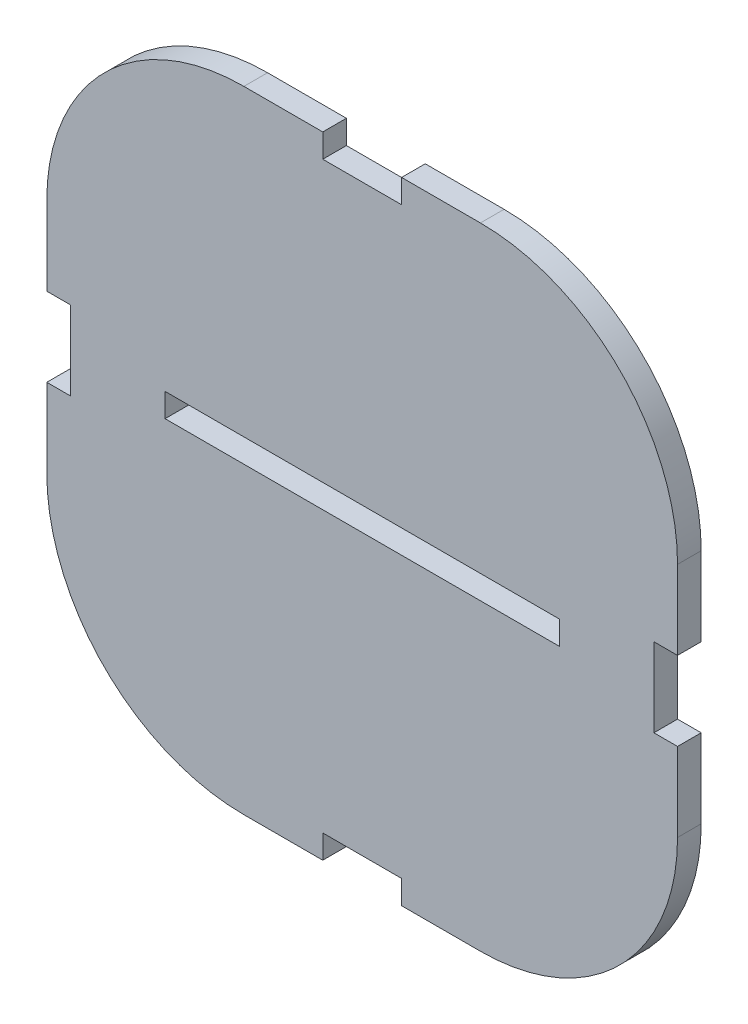
ISO-10303-21;
HEADER;
FILE_DESCRIPTION(('STEP AP214'),'2;1');
FILE_NAME('part.step','',(''),(''),'','','');
FILE_SCHEMA(('AUTOMOTIVE_DESIGN { 1 0 10303 214 1 1 1 1 }'));
ENDSEC;
DATA;
#1=APPLICATION_CONTEXT('core data for automotive mechanical design processes');
#2=APPLICATION_PROTOCOL_DEFINITION('international standard','automotive_design',2000,#1);
#3=PRODUCT_CONTEXT('',#1,'mechanical');
#4=PRODUCT('Part','Part','',(#3));
#5=PRODUCT_RELATED_PRODUCT_CATEGORY('part','',(#4));
#6=PRODUCT_DEFINITION_FORMATION('','',#4);
#7=PRODUCT_DEFINITION_CONTEXT('part definition',#1,'design');
#8=PRODUCT_DEFINITION('design','',#6,#7);
#9=PRODUCT_DEFINITION_SHAPE('','',#8);
#10=(LENGTH_UNIT() NAMED_UNIT(*) SI_UNIT(.MILLI.,.METRE.));
#11=(NAMED_UNIT(*) PLANE_ANGLE_UNIT() SI_UNIT($,.RADIAN.));
#12=(NAMED_UNIT(*) SI_UNIT($,.STERADIAN.) SOLID_ANGLE_UNIT());
#13=UNCERTAINTY_MEASURE_WITH_UNIT(LENGTH_MEASURE(1.E-05),#10,'distance_accuracy_value','');
#14=(GEOMETRIC_REPRESENTATION_CONTEXT(3) GLOBAL_UNCERTAINTY_ASSIGNED_CONTEXT((#13)) GLOBAL_UNIT_ASSIGNED_CONTEXT((#10,
#11,#12)) REPRESENTATION_CONTEXT('',''));
#15=CARTESIAN_POINT('',(0.,0.,0.));
#16=DIRECTION('',(0.,0.,1.));
#17=DIRECTION('',(1.,0.,0.));
#18=AXIS2_PLACEMENT_3D('',#15,#16,#17);
#19=CARTESIAN_POINT('',(0.,40.,3.));
#20=DIRECTION('',(0.,1.,0.));
#21=DIRECTION('',(-1.,0.,0.));
#22=AXIS2_PLACEMENT_3D('',#19,#20,#21);
#23=PLANE('',#22);
#24=DIRECTION('',(1.,0.,0.));
#25=VECTOR('',#24,1.);
#26=CARTESIAN_POINT('',(0.,40.,0.));
#27=LINE('',#26,#25);
#28=CARTESIAN_POINT('',(-15.,40.,0.));
#29=VERTEX_POINT('',#28);
#30=CARTESIAN_POINT('',(-5.,40.,0.));
#31=VERTEX_POINT('',#30);
#32=EDGE_CURVE('E268',#29,#31,#27,.T.);
#33=ORIENTED_EDGE('',*,*,#32,.F.);
#34=DIRECTION('',(0.,0.,-1.));
#35=VECTOR('',#34,1.);
#36=CARTESIAN_POINT('',(-15.,40.,3.));
#37=LINE('',#36,#35);
#38=CARTESIAN_POINT('',(-15.,40.,3.));
#39=VERTEX_POINT('',#38);
#40=EDGE_CURVE('E11',#39,#29,#37,.T.);
#41=ORIENTED_EDGE('',*,*,#40,.F.);
#42=DIRECTION('',(1.,0.,0.));
#43=VECTOR('',#42,1.);
#44=CARTESIAN_POINT('',(0.,40.,3.));
#45=LINE('',#44,#43);
#46=CARTESIAN_POINT('',(-5.,40.,3.));
#47=VERTEX_POINT('',#46);
#48=EDGE_CURVE('E695',#39,#47,#45,.T.);
#49=ORIENTED_EDGE('',*,*,#48,.T.);
#50=DIRECTION('',(0.,0.,-1.));
#51=VECTOR('',#50,1.);
#52=CARTESIAN_POINT('',(-5.,40.,3.));
#53=LINE('',#52,#51);
#54=EDGE_CURVE('E53',#47,#31,#53,.T.);
#55=ORIENTED_EDGE('',*,*,#54,.T.);
#56=EDGE_LOOP('',(#33,#41,#49,#55));
#57=FACE_BOUND('',#56,.T.);
#58=ADVANCED_FACE('F34',(#57),#23,.T.);
#59=CARTESIAN_POINT('',(-15.,15.,3.));
#60=DIRECTION('',(0.,0.,-1.));
#61=DIRECTION('',(-1.,0.,0.));
#62=AXIS2_PLACEMENT_3D('',#59,#60,#61);
#63=CYLINDRICAL_SURFACE('',#62,25.);
#64=CARTESIAN_POINT('',(-15.,15.,0.));
#65=DIRECTION('',(0.,0.,1.));
#66=DIRECTION('',(1.,0.,0.));
#67=AXIS2_PLACEMENT_3D('',#64,#65,#66);
#68=CIRCLE('',#67,25.);
#69=CARTESIAN_POINT('',(-40.,15.,0.));
#70=VERTEX_POINT('',#69);
#71=EDGE_CURVE('E270',#29,#70,#68,.T.);
#72=ORIENTED_EDGE('',*,*,#71,.T.);
#73=DIRECTION('',(0.,0.,-1.));
#74=VECTOR('',#73,1.);
#75=CARTESIAN_POINT('',(-40.,15.,3.));
#76=LINE('',#75,#74);
#77=CARTESIAN_POINT('',(-40.,15.,3.));
#78=VERTEX_POINT('',#77);
#79=EDGE_CURVE('E44',#78,#70,#76,.T.);
#80=ORIENTED_EDGE('',*,*,#79,.F.);
#81=CARTESIAN_POINT('',(-15.,15.,3.));
#82=DIRECTION('',(0.,0.,1.));
#83=DIRECTION('',(1.,0.,0.));
#84=AXIS2_PLACEMENT_3D('',#81,#82,#83);
#85=CIRCLE('',#84,25.);
#86=EDGE_CURVE('E692',#39,#78,#85,.T.);
#87=ORIENTED_EDGE('',*,*,#86,.F.);
#88=ORIENTED_EDGE('',*,*,#40,.T.);
#89=EDGE_LOOP('',(#72,#80,#87,#88));
#90=FACE_BOUND('',#89,.T.);
#91=ADVANCED_FACE('F408',(#90),#63,.T.);
#92=CARTESIAN_POINT('',(-40.,0.,3.));
#93=DIRECTION('',(1.,0.,0.));
#94=DIRECTION('',(0.,1.,0.));
#95=AXIS2_PLACEMENT_3D('',#92,#93,#94);
#96=PLANE('',#95);
#97=DIRECTION('',(0.,-1.,0.));
#98=VECTOR('',#97,1.);
#99=CARTESIAN_POINT('',(-40.,0.,0.));
#100=LINE('',#99,#98);
#101=CARTESIAN_POINT('',(-40.,4.99999999999999,0.));
#102=VERTEX_POINT('',#101);
#103=EDGE_CURVE('E274',#70,#102,#100,.T.);
#104=ORIENTED_EDGE('',*,*,#103,.T.);
#105=DIRECTION('',(0.,0.,-1.));
#106=VECTOR('',#105,1.);
#107=CARTESIAN_POINT('',(-40.,4.99999999999999,3.));
#108=LINE('',#107,#106);
#109=CARTESIAN_POINT('',(-40.,4.99999999999999,3.));
#110=VERTEX_POINT('',#109);
#111=EDGE_CURVE('E372',#110,#102,#108,.T.);
#112=ORIENTED_EDGE('',*,*,#111,.F.);
#113=DIRECTION('',(0.,-1.,0.));
#114=VECTOR('',#113,1.);
#115=CARTESIAN_POINT('',(-40.,0.,3.));
#116=LINE('',#115,#114);
#117=EDGE_CURVE('E688',#78,#110,#116,.T.);
#118=ORIENTED_EDGE('',*,*,#117,.F.);
#119=ORIENTED_EDGE('',*,*,#79,.T.);
#120=EDGE_LOOP('',(#104,#112,#118,#119));
#121=FACE_BOUND('',#120,.T.);
#122=ADVANCED_FACE('F414',(#121),#96,.F.);
#123=CARTESIAN_POINT('',(0.,4.99999999999999,3.));
#124=DIRECTION('',(0.,1.,0.));
#125=DIRECTION('',(0.,0.,1.));
#126=AXIS2_PLACEMENT_3D('',#123,#124,#125);
#127=PLANE('',#126);
#128=DIRECTION('',(1.,0.,0.));
#129=VECTOR('',#128,1.);
#130=CARTESIAN_POINT('',(0.,4.99999999999999,0.));
#131=LINE('',#130,#129);
#132=CARTESIAN_POINT('',(-37.,4.99999999999999,0.));
#133=VERTEX_POINT('',#132);
#134=EDGE_CURVE('E277',#102,#133,#131,.T.);
#135=ORIENTED_EDGE('',*,*,#134,.T.);
#136=DIRECTION('',(0.,0.,-1.));
#137=VECTOR('',#136,1.);
#138=CARTESIAN_POINT('',(-37.,4.99999999999999,3.));
#139=LINE('',#138,#137);
#140=CARTESIAN_POINT('',(-37.,4.99999999999999,3.));
#141=VERTEX_POINT('',#140);
#142=EDGE_CURVE('E370',#141,#133,#139,.T.);
#143=ORIENTED_EDGE('',*,*,#142,.F.);
#144=DIRECTION('',(1.,0.,0.));
#145=VECTOR('',#144,1.);
#146=CARTESIAN_POINT('',(0.,4.99999999999999,3.));
#147=LINE('',#146,#145);
#148=EDGE_CURVE('E683',#110,#141,#147,.T.);
#149=ORIENTED_EDGE('',*,*,#148,.F.);
#150=ORIENTED_EDGE('',*,*,#111,.T.);
#151=EDGE_LOOP('',(#135,#143,#149,#150));
#152=FACE_BOUND('',#151,.T.);
#153=ADVANCED_FACE('F633',(#152),#127,.F.);
#154=CARTESIAN_POINT('',(-37.,0.,3.));
#155=DIRECTION('',(-1.,0.,0.));
#156=DIRECTION('',(0.,0.,1.));
#157=AXIS2_PLACEMENT_3D('',#154,#155,#156);
#158=PLANE('',#157);
#159=DIRECTION('',(0.,1.,0.));
#160=VECTOR('',#159,1.);
#161=CARTESIAN_POINT('',(-37.,0.,0.));
#162=LINE('',#161,#160);
#163=CARTESIAN_POINT('',(-37.,-5.00000000000001,0.));
#164=VERTEX_POINT('',#163);
#165=EDGE_CURVE('E281',#164,#133,#162,.T.);
#166=ORIENTED_EDGE('',*,*,#165,.F.);
#167=DIRECTION('',(0.,0.,-1.));
#168=VECTOR('',#167,1.);
#169=CARTESIAN_POINT('',(-37.,-5.00000000000001,3.));
#170=LINE('',#169,#168);
#171=CARTESIAN_POINT('',(-37.,-5.00000000000001,3.));
#172=VERTEX_POINT('',#171);
#173=EDGE_CURVE('E368',#172,#164,#170,.T.);
#174=ORIENTED_EDGE('',*,*,#173,.F.);
#175=DIRECTION('',(0.,1.,0.));
#176=VECTOR('',#175,1.);
#177=CARTESIAN_POINT('',(-37.,0.,3.));
#178=LINE('',#177,#176);
#179=EDGE_CURVE('E687',#172,#141,#178,.T.);
#180=ORIENTED_EDGE('',*,*,#179,.T.);
#181=ORIENTED_EDGE('',*,*,#142,.T.);
#182=EDGE_LOOP('',(#166,#174,#180,#181));
#183=FACE_BOUND('',#182,.T.);
#184=ADVANCED_FACE('F624',(#183),#158,.T.);
#185=CARTESIAN_POINT('',(0.,-4.99999999999999,3.));
#186=DIRECTION('',(0.,1.,0.));
#187=DIRECTION('',(-1.,0.,0.));
#188=AXIS2_PLACEMENT_3D('',#185,#186,#187);
#189=PLANE('',#188);
#190=DIRECTION('',(1.,0.,0.));
#191=VECTOR('',#190,1.);
#192=CARTESIAN_POINT('',(0.,-4.99999999999999,0.));
#193=LINE('',#192,#191);
#194=CARTESIAN_POINT('',(-40.,-5.00000000000001,0.));
#195=VERTEX_POINT('',#194);
#196=EDGE_CURVE('E284',#195,#164,#193,.T.);
#197=ORIENTED_EDGE('',*,*,#196,.F.);
#198=DIRECTION('',(0.,0.,-1.));
#199=VECTOR('',#198,1.);
#200=CARTESIAN_POINT('',(-40.,-5.00000000000001,3.));
#201=LINE('',#200,#199);
#202=CARTESIAN_POINT('',(-40.,-5.00000000000001,3.));
#203=VERTEX_POINT('',#202);
#204=EDGE_CURVE('E366',#203,#195,#201,.T.);
#205=ORIENTED_EDGE('',*,*,#204,.F.);
#206=DIRECTION('',(1.,0.,0.));
#207=VECTOR('',#206,1.);
#208=CARTESIAN_POINT('',(0.,-4.99999999999999,3.));
#209=LINE('',#208,#207);
#210=EDGE_CURVE('E699',#203,#172,#209,.T.);
#211=ORIENTED_EDGE('',*,*,#210,.T.);
#212=ORIENTED_EDGE('',*,*,#173,.T.);
#213=EDGE_LOOP('',(#197,#205,#211,#212));
#214=FACE_BOUND('',#213,.T.);
#215=ADVANCED_FACE('F615',(#214),#189,.T.);
#216=CARTESIAN_POINT('',(-40.,-15.,0.));
#217=VERTEX_POINT('',#216);
#218=EDGE_CURVE('E278',#195,#217,#100,.T.);
#219=ORIENTED_EDGE('',*,*,#218,.T.);
#220=DIRECTION('',(0.,0.,-1.));
#221=VECTOR('',#220,1.);
#222=CARTESIAN_POINT('',(-40.,-15.,3.));
#223=LINE('',#222,#221);
#224=CARTESIAN_POINT('',(-40.,-15.,3.));
#225=VERTEX_POINT('',#224);
#226=EDGE_CURVE('E363',#225,#217,#223,.T.);
#227=ORIENTED_EDGE('',*,*,#226,.F.);
#228=EDGE_CURVE('E694',#203,#225,#116,.T.);
#229=ORIENTED_EDGE('',*,*,#228,.F.);
#230=ORIENTED_EDGE('',*,*,#204,.T.);
#231=EDGE_LOOP('',(#219,#227,#229,#230));
#232=FACE_BOUND('',#231,.T.);
#233=ADVANCED_FACE('F606',(#232),#96,.F.);
#234=CARTESIAN_POINT('',(-15.,-15.,3.));
#235=DIRECTION('',(0.,0.,-1.));
#236=DIRECTION('',(-1.,0.,0.));
#237=AXIS2_PLACEMENT_3D('',#234,#235,#236);
#238=CYLINDRICAL_SURFACE('',#237,25.);
#239=CARTESIAN_POINT('',(-15.,-15.,0.));
#240=DIRECTION('',(0.,0.,1.));
#241=DIRECTION('',(1.,0.,0.));
#242=AXIS2_PLACEMENT_3D('',#239,#240,#241);
#243=CIRCLE('',#242,25.);
#244=CARTESIAN_POINT('',(-15.,-40.,0.));
#245=VERTEX_POINT('',#244);
#246=EDGE_CURVE('E287',#217,#245,#243,.T.);
#247=ORIENTED_EDGE('',*,*,#246,.T.);
#248=DIRECTION('',(0.,0.,-1.));
#249=VECTOR('',#248,1.);
#250=CARTESIAN_POINT('',(-15.,-40.,3.));
#251=LINE('',#250,#249);
#252=CARTESIAN_POINT('',(-15.,-40.,3.));
#253=VERTEX_POINT('',#252);
#254=EDGE_CURVE('E360',#253,#245,#251,.T.);
#255=ORIENTED_EDGE('',*,*,#254,.F.);
#256=CARTESIAN_POINT('',(-15.,-15.,3.));
#257=DIRECTION('',(0.,0.,1.));
#258=DIRECTION('',(1.,0.,0.));
#259=AXIS2_PLACEMENT_3D('',#256,#257,#258);
#260=CIRCLE('',#259,25.);
#261=EDGE_CURVE('E698',#225,#253,#260,.T.);
#262=ORIENTED_EDGE('',*,*,#261,.F.);
#263=ORIENTED_EDGE('',*,*,#226,.T.);
#264=EDGE_LOOP('',(#247,#255,#262,#263));
#265=FACE_BOUND('',#264,.T.);
#266=ADVANCED_FACE('F598',(#265),#238,.T.);
#267=CARTESIAN_POINT('',(0.,-40.,3.));
#268=DIRECTION('',(0.,1.,0.));
#269=DIRECTION('',(-1.,0.,0.));
#270=AXIS2_PLACEMENT_3D('',#267,#268,#269);
#271=PLANE('',#270);
#272=DIRECTION('',(1.,0.,0.));
#273=VECTOR('',#272,1.);
#274=CARTESIAN_POINT('',(0.,-40.,0.));
#275=LINE('',#274,#273);
#276=CARTESIAN_POINT('',(-4.99999999999998,-40.,0.));
#277=VERTEX_POINT('',#276);
#278=EDGE_CURVE('E290',#245,#277,#275,.T.);
#279=ORIENTED_EDGE('',*,*,#278,.T.);
#280=DIRECTION('',(0.,0.,-1.));
#281=VECTOR('',#280,1.);
#282=CARTESIAN_POINT('',(-4.99999999999998,-40.,3.));
#283=LINE('',#282,#281);
#284=CARTESIAN_POINT('',(-4.99999999999998,-40.,3.));
#285=VERTEX_POINT('',#284);
#286=EDGE_CURVE('E357',#285,#277,#283,.T.);
#287=ORIENTED_EDGE('',*,*,#286,.F.);
#288=DIRECTION('',(1.,0.,0.));
#289=VECTOR('',#288,1.);
#290=CARTESIAN_POINT('',(0.,-40.,3.));
#291=LINE('',#290,#289);
#292=EDGE_CURVE('E704',#253,#285,#291,.T.);
#293=ORIENTED_EDGE('',*,*,#292,.F.);
#294=ORIENTED_EDGE('',*,*,#254,.T.);
#295=EDGE_LOOP('',(#279,#287,#293,#294));
#296=FACE_BOUND('',#295,.T.);
#297=ADVANCED_FACE('F565',(#296),#271,.F.);
#298=CARTESIAN_POINT('',(-5.00000000000016,0.,3.));
#299=DIRECTION('',(-1.,0.,0.));
#300=DIRECTION('',(0.,-1.,0.));
#301=AXIS2_PLACEMENT_3D('',#298,#299,#300);
#302=PLANE('',#301);
#303=DIRECTION('',(0.,1.,0.));
#304=VECTOR('',#303,1.);
#305=CARTESIAN_POINT('',(-5.00000000000016,0.,0.));
#306=LINE('',#305,#304);
#307=CARTESIAN_POINT('',(-4.99999999999999,-37.,0.));
#308=VERTEX_POINT('',#307);
#309=EDGE_CURVE('E293',#277,#308,#306,.T.);
#310=ORIENTED_EDGE('',*,*,#309,.T.);
#311=DIRECTION('',(0.,0.,-1.));
#312=VECTOR('',#311,1.);
#313=CARTESIAN_POINT('',(-4.99999999999999,-37.,3.));
#314=LINE('',#313,#312);
#315=CARTESIAN_POINT('',(-4.99999999999999,-37.,3.));
#316=VERTEX_POINT('',#315);
#317=EDGE_CURVE('E354',#316,#308,#314,.T.);
#318=ORIENTED_EDGE('',*,*,#317,.F.);
#319=DIRECTION('',(0.,1.,0.));
#320=VECTOR('',#319,1.);
#321=CARTESIAN_POINT('',(-5.00000000000016,0.,3.));
#322=LINE('',#321,#320);
#323=EDGE_CURVE('E712',#285,#316,#322,.T.);
#324=ORIENTED_EDGE('',*,*,#323,.F.);
#325=ORIENTED_EDGE('',*,*,#286,.T.);
#326=EDGE_LOOP('',(#310,#318,#324,#325));
#327=FACE_BOUND('',#326,.T.);
#328=ADVANCED_FACE('F581',(#327),#302,.F.);
#329=CARTESIAN_POINT('',(0.,-37.,3.));
#330=DIRECTION('',(0.,1.,0.));
#331=DIRECTION('',(-1.,0.,0.));
#332=AXIS2_PLACEMENT_3D('',#329,#330,#331);
#333=PLANE('',#332);
#334=DIRECTION('',(1.,0.,0.));
#335=VECTOR('',#334,1.);
#336=CARTESIAN_POINT('',(0.,-37.,0.));
#337=LINE('',#336,#335);
#338=CARTESIAN_POINT('',(5.00000000000001,-37.,0.));
#339=VERTEX_POINT('',#338);
#340=EDGE_CURVE('E297',#308,#339,#337,.T.);
#341=ORIENTED_EDGE('',*,*,#340,.T.);
#342=DIRECTION('',(0.,0.,-1.));
#343=VECTOR('',#342,1.);
#344=CARTESIAN_POINT('',(5.00000000000001,-37.,3.));
#345=LINE('',#344,#343);
#346=CARTESIAN_POINT('',(5.00000000000001,-37.,3.));
#347=VERTEX_POINT('',#346);
#348=EDGE_CURVE('E352',#347,#339,#345,.T.);
#349=ORIENTED_EDGE('',*,*,#348,.F.);
#350=DIRECTION('',(1.,0.,0.));
#351=VECTOR('',#350,1.);
#352=CARTESIAN_POINT('',(0.,-37.,3.));
#353=LINE('',#352,#351);
#354=EDGE_CURVE('E716',#316,#347,#353,.T.);
#355=ORIENTED_EDGE('',*,*,#354,.F.);
#356=ORIENTED_EDGE('',*,*,#317,.T.);
#357=EDGE_LOOP('',(#341,#349,#355,#356));
#358=FACE_BOUND('',#357,.T.);
#359=ADVANCED_FACE('F572',(#358),#333,.F.);
#360=CARTESIAN_POINT('',(4.99999999999984,0.,3.));
#361=DIRECTION('',(-1.,0.,0.));
#362=DIRECTION('',(0.,-1.,0.));
#363=AXIS2_PLACEMENT_3D('',#360,#361,#362);
#364=PLANE('',#363);
#365=DIRECTION('',(0.,1.,0.));
#366=VECTOR('',#365,1.);
#367=CARTESIAN_POINT('',(4.99999999999984,0.,0.));
#368=LINE('',#367,#366);
#369=CARTESIAN_POINT('',(5.00000000000001,-40.,0.));
#370=VERTEX_POINT('',#369);
#371=EDGE_CURVE('E300',#370,#339,#368,.T.);
#372=ORIENTED_EDGE('',*,*,#371,.F.);
#373=DIRECTION('',(0.,0.,-1.));
#374=VECTOR('',#373,1.);
#375=CARTESIAN_POINT('',(5.00000000000001,-40.,3.));
#376=LINE('',#375,#374);
#377=CARTESIAN_POINT('',(5.00000000000001,-40.,3.));
#378=VERTEX_POINT('',#377);
#379=EDGE_CURVE('E350',#378,#370,#376,.T.);
#380=ORIENTED_EDGE('',*,*,#379,.F.);
#381=DIRECTION('',(0.,1.,0.));
#382=VECTOR('',#381,1.);
#383=CARTESIAN_POINT('',(4.99999999999984,0.,3.));
#384=LINE('',#383,#382);
#385=EDGE_CURVE('E718',#378,#347,#384,.T.);
#386=ORIENTED_EDGE('',*,*,#385,.T.);
#387=ORIENTED_EDGE('',*,*,#348,.T.);
#388=EDGE_LOOP('',(#372,#380,#386,#387));
#389=FACE_BOUND('',#388,.T.);
#390=ADVANCED_FACE('F562',(#389),#364,.T.);
#391=CARTESIAN_POINT('',(15.,-40.,0.));
#392=VERTEX_POINT('',#391);
#393=EDGE_CURVE('E294',#370,#392,#275,.T.);
#394=ORIENTED_EDGE('',*,*,#393,.T.);
#395=DIRECTION('',(0.,0.,-1.));
#396=VECTOR('',#395,1.);
#397=CARTESIAN_POINT('',(15.,-40.,3.));
#398=LINE('',#397,#396);
#399=CARTESIAN_POINT('',(15.,-40.,3.));
#400=VERTEX_POINT('',#399);
#401=EDGE_CURVE('E347',#400,#392,#398,.T.);
#402=ORIENTED_EDGE('',*,*,#401,.F.);
#403=EDGE_CURVE('E713',#378,#400,#291,.T.);
#404=ORIENTED_EDGE('',*,*,#403,.F.);
#405=ORIENTED_EDGE('',*,*,#379,.T.);
#406=EDGE_LOOP('',(#394,#402,#404,#405));
#407=FACE_BOUND('',#406,.T.);
#408=ADVANCED_FACE('F553',(#407),#271,.F.);
#409=CARTESIAN_POINT('',(15.,-15.,3.));
#410=DIRECTION('',(0.,0.,-1.));
#411=DIRECTION('',(-1.,0.,0.));
#412=AXIS2_PLACEMENT_3D('',#409,#410,#411);
#413=CYLINDRICAL_SURFACE('',#412,25.);
#414=CARTESIAN_POINT('',(15.,-15.,0.));
#415=DIRECTION('',(0.,0.,1.));
#416=DIRECTION('',(1.,0.,0.));
#417=AXIS2_PLACEMENT_3D('',#414,#415,#416);
#418=CIRCLE('',#417,25.);
#419=CARTESIAN_POINT('',(40.,-15.,0.));
#420=VERTEX_POINT('',#419);
#421=EDGE_CURVE('E303',#392,#420,#418,.T.);
#422=ORIENTED_EDGE('',*,*,#421,.T.);
#423=DIRECTION('',(0.,0.,-1.));
#424=VECTOR('',#423,1.);
#425=CARTESIAN_POINT('',(40.,-15.,3.));
#426=LINE('',#425,#424);
#427=CARTESIAN_POINT('',(40.,-15.,3.));
#428=VERTEX_POINT('',#427);
#429=EDGE_CURVE('E345',#428,#420,#426,.T.);
#430=ORIENTED_EDGE('',*,*,#429,.F.);
#431=CARTESIAN_POINT('',(15.,-15.,3.));
#432=DIRECTION('',(0.,0.,1.));
#433=DIRECTION('',(1.,0.,0.));
#434=AXIS2_PLACEMENT_3D('',#431,#432,#433);
#435=CIRCLE('',#434,25.);
#436=EDGE_CURVE('E721',#400,#428,#435,.T.);
#437=ORIENTED_EDGE('',*,*,#436,.F.);
#438=ORIENTED_EDGE('',*,*,#401,.T.);
#439=EDGE_LOOP('',(#422,#430,#437,#438));
#440=FACE_BOUND('',#439,.T.);
#441=ADVANCED_FACE('F545',(#440),#413,.T.);
#442=CARTESIAN_POINT('',(40.,0.,3.));
#443=DIRECTION('',(1.,0.,0.));
#444=DIRECTION('',(0.,0.,-1.));
#445=AXIS2_PLACEMENT_3D('',#442,#443,#444);
#446=PLANE('',#445);
#447=DIRECTION('',(0.,-1.,0.));
#448=VECTOR('',#447,1.);
#449=CARTESIAN_POINT('',(40.,0.,0.));
#450=LINE('',#449,#448);
#451=CARTESIAN_POINT('',(40.,-5.00000000000001,0.));
#452=VERTEX_POINT('',#451);
#453=EDGE_CURVE('E306',#452,#420,#450,.T.);
#454=ORIENTED_EDGE('',*,*,#453,.F.);
#455=DIRECTION('',(0.,0.,-1.));
#456=VECTOR('',#455,1.);
#457=CARTESIAN_POINT('',(40.,-5.00000000000001,3.));
#458=LINE('',#457,#456);
#459=CARTESIAN_POINT('',(40.,-5.00000000000001,3.));
#460=VERTEX_POINT('',#459);
#461=EDGE_CURVE('E343',#460,#452,#458,.T.);
#462=ORIENTED_EDGE('',*,*,#461,.F.);
#463=DIRECTION('',(0.,-1.,0.));
#464=VECTOR('',#463,1.);
#465=CARTESIAN_POINT('',(40.,0.,3.));
#466=LINE('',#465,#464);
#467=EDGE_CURVE('E723',#460,#428,#466,.T.);
#468=ORIENTED_EDGE('',*,*,#467,.T.);
#469=ORIENTED_EDGE('',*,*,#429,.T.);
#470=EDGE_LOOP('',(#454,#462,#468,#469));
#471=FACE_BOUND('',#470,.T.);
#472=ADVANCED_FACE('F512',(#471),#446,.T.);
#473=CARTESIAN_POINT('',(0.,-4.99999999999999,3.));
#474=DIRECTION('',(0.,-1.,0.));
#475=DIRECTION('',(1.,0.,0.));
#476=AXIS2_PLACEMENT_3D('',#473,#474,#475);
#477=PLANE('',#476);
#478=DIRECTION('',(-1.,0.,0.));
#479=VECTOR('',#478,1.);
#480=CARTESIAN_POINT('',(0.,-4.99999999999999,0.));
#481=LINE('',#480,#479);
#482=CARTESIAN_POINT('',(37.,-5.00000000000001,0.));
#483=VERTEX_POINT('',#482);
#484=EDGE_CURVE('E309',#452,#483,#481,.T.);
#485=ORIENTED_EDGE('',*,*,#484,.T.);
#486=DIRECTION('',(0.,0.,-1.));
#487=VECTOR('',#486,1.);
#488=CARTESIAN_POINT('',(37.,-5.00000000000001,3.));
#489=LINE('',#488,#487);
#490=CARTESIAN_POINT('',(37.,-5.00000000000001,3.));
#491=VERTEX_POINT('',#490);
#492=EDGE_CURVE('E340',#491,#483,#489,.T.);
#493=ORIENTED_EDGE('',*,*,#492,.F.);
#494=DIRECTION('',(-1.,0.,0.));
#495=VECTOR('',#494,1.);
#496=CARTESIAN_POINT('',(0.,-4.99999999999999,3.));
#497=LINE('',#496,#495);
#498=EDGE_CURVE('E726',#460,#491,#497,.T.);
#499=ORIENTED_EDGE('',*,*,#498,.F.);
#500=ORIENTED_EDGE('',*,*,#461,.T.);
#501=EDGE_LOOP('',(#485,#493,#499,#500));
#502=FACE_BOUND('',#501,.T.);
#503=ADVANCED_FACE('F528',(#502),#477,.F.);
#504=CARTESIAN_POINT('',(37.,0.,3.));
#505=DIRECTION('',(-1.,0.,0.));
#506=DIRECTION('',(0.,0.,1.));
#507=AXIS2_PLACEMENT_3D('',#504,#505,#506);
#508=PLANE('',#507);
#509=DIRECTION('',(0.,1.,0.));
#510=VECTOR('',#509,1.);
#511=CARTESIAN_POINT('',(37.,0.,0.));
#512=LINE('',#511,#510);
#513=CARTESIAN_POINT('',(37.,4.99999999999999,0.));
#514=VERTEX_POINT('',#513);
#515=EDGE_CURVE('E313',#483,#514,#512,.T.);
#516=ORIENTED_EDGE('',*,*,#515,.T.);
#517=DIRECTION('',(0.,0.,-1.));
#518=VECTOR('',#517,1.);
#519=CARTESIAN_POINT('',(37.,4.99999999999999,3.));
#520=LINE('',#519,#518);
#521=CARTESIAN_POINT('',(37.,4.99999999999999,3.));
#522=VERTEX_POINT('',#521);
#523=EDGE_CURVE('E338',#522,#514,#520,.T.);
#524=ORIENTED_EDGE('',*,*,#523,.F.);
#525=DIRECTION('',(0.,1.,0.));
#526=VECTOR('',#525,1.);
#527=CARTESIAN_POINT('',(37.,0.,3.));
#528=LINE('',#527,#526);
#529=EDGE_CURVE('E730',#491,#522,#528,.T.);
#530=ORIENTED_EDGE('',*,*,#529,.F.);
#531=ORIENTED_EDGE('',*,*,#492,.T.);
#532=EDGE_LOOP('',(#516,#524,#530,#531));
#533=FACE_BOUND('',#532,.T.);
#534=ADVANCED_FACE('F519',(#533),#508,.F.);
#535=CARTESIAN_POINT('',(0.,4.99999999999999,3.));
#536=DIRECTION('',(0.,-1.,0.));
#537=DIRECTION('',(0.,0.,-1.));
#538=AXIS2_PLACEMENT_3D('',#535,#536,#537);
#539=PLANE('',#538);
#540=DIRECTION('',(-1.,0.,0.));
#541=VECTOR('',#540,1.);
#542=CARTESIAN_POINT('',(0.,4.99999999999999,0.));
#543=LINE('',#542,#541);
#544=CARTESIAN_POINT('',(40.,4.99999999999999,0.));
#545=VERTEX_POINT('',#544);
#546=EDGE_CURVE('E316',#545,#514,#543,.T.);
#547=ORIENTED_EDGE('',*,*,#546,.F.);
#548=DIRECTION('',(0.,0.,-1.));
#549=VECTOR('',#548,1.);
#550=CARTESIAN_POINT('',(40.,4.99999999999999,3.));
#551=LINE('',#550,#549);
#552=CARTESIAN_POINT('',(40.,4.99999999999999,3.));
#553=VERTEX_POINT('',#552);
#554=EDGE_CURVE('E336',#553,#545,#551,.T.);
#555=ORIENTED_EDGE('',*,*,#554,.F.);
#556=DIRECTION('',(-1.,0.,0.));
#557=VECTOR('',#556,1.);
#558=CARTESIAN_POINT('',(0.,4.99999999999999,3.));
#559=LINE('',#558,#557);
#560=EDGE_CURVE('E732',#553,#522,#559,.T.);
#561=ORIENTED_EDGE('',*,*,#560,.T.);
#562=ORIENTED_EDGE('',*,*,#523,.T.);
#563=EDGE_LOOP('',(#547,#555,#561,#562));
#564=FACE_BOUND('',#563,.T.);
#565=ADVANCED_FACE('F509',(#564),#539,.T.);
#566=CARTESIAN_POINT('',(40.,15.,0.));
#567=VERTEX_POINT('',#566);
#568=EDGE_CURVE('E310',#567,#545,#450,.T.);
#569=ORIENTED_EDGE('',*,*,#568,.F.);
#570=DIRECTION('',(0.,0.,-1.));
#571=VECTOR('',#570,1.);
#572=CARTESIAN_POINT('',(40.,15.,3.));
#573=LINE('',#572,#571);
#574=CARTESIAN_POINT('',(40.,15.,3.));
#575=VERTEX_POINT('',#574);
#576=EDGE_CURVE('E334',#575,#567,#573,.T.);
#577=ORIENTED_EDGE('',*,*,#576,.F.);
#578=EDGE_CURVE('E727',#575,#553,#466,.T.);
#579=ORIENTED_EDGE('',*,*,#578,.T.);
#580=ORIENTED_EDGE('',*,*,#554,.T.);
#581=EDGE_LOOP('',(#569,#577,#579,#580));
#582=FACE_BOUND('',#581,.T.);
#583=ADVANCED_FACE('F426',(#582),#446,.T.);
#584=CARTESIAN_POINT('',(15.,15.,3.));
#585=DIRECTION('',(0.,0.,-1.));
#586=DIRECTION('',(-1.,0.,0.));
#587=AXIS2_PLACEMENT_3D('',#584,#585,#586);
#588=CYLINDRICAL_SURFACE('',#587,25.);
#589=CARTESIAN_POINT('',(15.,15.,0.));
#590=DIRECTION('',(0.,0.,1.));
#591=DIRECTION('',(1.,0.,0.));
#592=AXIS2_PLACEMENT_3D('',#589,#590,#591);
#593=CIRCLE('',#592,25.);
#594=CARTESIAN_POINT('',(15.,40.,0.));
#595=VERTEX_POINT('',#594);
#596=EDGE_CURVE('E319',#595,#567,#593,.F.);
#597=ORIENTED_EDGE('',*,*,#596,.F.);
#598=DIRECTION('',(0.,0.,-1.));
#599=VECTOR('',#598,1.);
#600=CARTESIAN_POINT('',(15.,40.,3.));
#601=LINE('',#600,#599);
#602=CARTESIAN_POINT('',(15.,40.,3.));
#603=VERTEX_POINT('',#602);
#604=EDGE_CURVE('E332',#603,#595,#601,.T.);
#605=ORIENTED_EDGE('',*,*,#604,.F.);
#606=CARTESIAN_POINT('',(15.,15.,3.));
#607=DIRECTION('',(0.,0.,1.));
#608=DIRECTION('',(1.,0.,0.));
#609=AXIS2_PLACEMENT_3D('',#606,#607,#608);
#610=CIRCLE('',#609,25.);
#611=EDGE_CURVE('E734',#603,#575,#610,.F.);
#612=ORIENTED_EDGE('',*,*,#611,.T.);
#613=ORIENTED_EDGE('',*,*,#576,.T.);
#614=EDGE_LOOP('',(#597,#605,#612,#613));
#615=FACE_BOUND('',#614,.T.);
#616=ADVANCED_FACE('F420',(#615),#588,.T.);
#617=CARTESIAN_POINT('',(5.,40.,0.));
#618=VERTEX_POINT('',#617);
#619=EDGE_CURVE('E271',#618,#595,#27,.T.);
#620=ORIENTED_EDGE('',*,*,#619,.F.);
#621=DIRECTION('',(0.,0.,-1.));
#622=VECTOR('',#621,1.);
#623=CARTESIAN_POINT('',(5.,40.,3.));
#624=LINE('',#623,#622);
#625=CARTESIAN_POINT('',(5.,40.,3.));
#626=VERTEX_POINT('',#625);
#627=EDGE_CURVE('E247',#626,#618,#624,.T.);
#628=ORIENTED_EDGE('',*,*,#627,.F.);
#629=EDGE_CURVE('E237',#626,#603,#45,.T.);
#630=ORIENTED_EDGE('',*,*,#629,.T.);
#631=ORIENTED_EDGE('',*,*,#604,.T.);
#632=EDGE_LOOP('',(#620,#628,#630,#631));
#633=FACE_BOUND('',#632,.T.);
#634=ADVANCED_FACE('F410',(#633),#23,.T.);
#635=CARTESIAN_POINT('',(5.00000000000002,0.,3.));
#636=DIRECTION('',(1.,0.,0.));
#637=DIRECTION('',(0.,1.,0.));
#638=AXIS2_PLACEMENT_3D('',#635,#636,#637);
#639=PLANE('',#638);
#640=DIRECTION('',(0.,-1.,0.));
#641=VECTOR('',#640,1.);
#642=CARTESIAN_POINT('',(5.00000000000002,0.,0.));
#643=LINE('',#642,#641);
#644=CARTESIAN_POINT('',(5.00000000000001,37.,0.));
#645=VERTEX_POINT('',#644);
#646=EDGE_CURVE('E244',#618,#645,#643,.T.);
#647=ORIENTED_EDGE('',*,*,#646,.T.);
#648=DIRECTION('',(0.,0.,-1.));
#649=VECTOR('',#648,1.);
#650=CARTESIAN_POINT('',(5.00000000000001,37.,3.));
#651=LINE('',#650,#649);
#652=CARTESIAN_POINT('',(5.00000000000001,37.,3.));
#653=VERTEX_POINT('',#652);
#654=EDGE_CURVE('E241',#653,#645,#651,.T.);
#655=ORIENTED_EDGE('',*,*,#654,.F.);
#656=DIRECTION('',(0.,-1.,0.));
#657=VECTOR('',#656,1.);
#658=CARTESIAN_POINT('',(5.00000000000002,0.,3.));
#659=LINE('',#658,#657);
#660=EDGE_CURVE('E228',#626,#653,#659,.T.);
#661=ORIENTED_EDGE('',*,*,#660,.F.);
#662=ORIENTED_EDGE('',*,*,#627,.T.);
#663=EDGE_LOOP('',(#647,#655,#661,#662));
#664=FACE_BOUND('',#663,.T.);
#665=ADVANCED_FACE('F242',(#664),#639,.F.);
#666=CARTESIAN_POINT('',(0.,37.,3.));
#667=DIRECTION('',(0.,1.,0.));
#668=DIRECTION('',(0.,0.,1.));
#669=AXIS2_PLACEMENT_3D('',#666,#667,#668);
#670=PLANE('',#669);
#671=DIRECTION('',(1.,0.,0.));
#672=VECTOR('',#671,1.);
#673=CARTESIAN_POINT('',(0.,37.,0.));
#674=LINE('',#673,#672);
#675=CARTESIAN_POINT('',(-4.99999999999999,37.,0.));
#676=VERTEX_POINT('',#675);
#677=EDGE_CURVE('E323',#676,#645,#674,.T.);
#678=ORIENTED_EDGE('',*,*,#677,.F.);
#679=DIRECTION('',(0.,0.,-1.));
#680=VECTOR('',#679,1.);
#681=CARTESIAN_POINT('',(-4.99999999999999,37.,3.));
#682=LINE('',#681,#680);
#683=CARTESIAN_POINT('',(-4.99999999999999,37.,3.));
#684=VERTEX_POINT('',#683);
#685=EDGE_CURVE('E138',#684,#676,#682,.T.);
#686=ORIENTED_EDGE('',*,*,#685,.F.);
#687=DIRECTION('',(1.,0.,0.));
#688=VECTOR('',#687,1.);
#689=CARTESIAN_POINT('',(0.,37.,3.));
#690=LINE('',#689,#688);
#691=EDGE_CURVE('E234',#684,#653,#690,.T.);
#692=ORIENTED_EDGE('',*,*,#691,.T.);
#693=ORIENTED_EDGE('',*,*,#654,.T.);
#694=EDGE_LOOP('',(#678,#686,#692,#693));
#695=FACE_BOUND('',#694,.T.);
#696=ADVANCED_FACE('F249',(#695),#670,.T.);
#697=CARTESIAN_POINT('',(0.,1.5,3.));
#698=DIRECTION('',(0.,1.,0.));
#699=DIRECTION('',(0.,0.,1.));
#700=AXIS2_PLACEMENT_3D('',#697,#698,#699);
#701=PLANE('',#700);
#702=DIRECTION('',(1.,0.,0.));
#703=VECTOR('',#702,1.);
#704=CARTESIAN_POINT('',(0.,1.5,0.));
#705=LINE('',#704,#703);
#706=CARTESIAN_POINT('',(-25.,1.5,0.));
#707=VERTEX_POINT('',#706);
#708=CARTESIAN_POINT('',(25.,1.5,0.));
#709=VERTEX_POINT('',#708);
#710=EDGE_CURVE('E256',#707,#709,#705,.T.);
#711=ORIENTED_EDGE('',*,*,#710,.T.);
#712=DIRECTION('',(0.,0.,-1.));
#713=VECTOR('',#712,1.);
#714=CARTESIAN_POINT('',(25.,1.5,3.));
#715=LINE('',#714,#713);
#716=CARTESIAN_POINT('',(25.,1.5,3.));
#717=VERTEX_POINT('',#716);
#718=EDGE_CURVE('E38',#717,#709,#715,.T.);
#719=ORIENTED_EDGE('',*,*,#718,.F.);
#720=DIRECTION('',(1.,0.,0.));
#721=VECTOR('',#720,1.);
#722=CARTESIAN_POINT('',(0.,1.5,3.));
#723=LINE('',#722,#721);
#724=CARTESIAN_POINT('',(-25.,1.5,3.));
#725=VERTEX_POINT('',#724);
#726=EDGE_CURVE('E328',#725,#717,#723,.T.);
#727=ORIENTED_EDGE('',*,*,#726,.F.);
#728=DIRECTION('',(0.,0.,-1.));
#729=VECTOR('',#728,1.);
#730=CARTESIAN_POINT('',(-25.,1.5,3.));
#731=LINE('',#730,#729);
#732=EDGE_CURVE('E252',#725,#707,#731,.T.);
#733=ORIENTED_EDGE('',*,*,#732,.T.);
#734=EDGE_LOOP('',(#711,#719,#727,#733));
#735=FACE_BOUND('',#734,.T.);
#736=ADVANCED_FACE('F36',(#735),#701,.F.);
#737=CARTESIAN_POINT('',(25.,0.,3.));
#738=DIRECTION('',(1.,0.,0.));
#739=DIRECTION('',(0.,0.,-1.));
#740=AXIS2_PLACEMENT_3D('',#737,#738,#739);
#741=PLANE('',#740);
#742=DIRECTION('',(0.,-1.,0.));
#743=VECTOR('',#742,1.);
#744=CARTESIAN_POINT('',(25.,0.,0.));
#745=LINE('',#744,#743);
#746=CARTESIAN_POINT('',(25.,-1.5,0.));
#747=VERTEX_POINT('',#746);
#748=EDGE_CURVE('E259',#709,#747,#745,.T.);
#749=ORIENTED_EDGE('',*,*,#748,.T.);
#750=DIRECTION('',(0.,0.,-1.));
#751=VECTOR('',#750,1.);
#752=CARTESIAN_POINT('',(25.,-1.5,3.));
#753=LINE('',#752,#751);
#754=CARTESIAN_POINT('',(25.,-1.5,3.));
#755=VERTEX_POINT('',#754);
#756=EDGE_CURVE('E379',#755,#747,#753,.T.);
#757=ORIENTED_EDGE('',*,*,#756,.F.);
#758=DIRECTION('',(0.,-1.,0.));
#759=VECTOR('',#758,1.);
#760=CARTESIAN_POINT('',(25.,0.,3.));
#761=LINE('',#760,#759);
#762=EDGE_CURVE('E151',#717,#755,#761,.T.);
#763=ORIENTED_EDGE('',*,*,#762,.F.);
#764=ORIENTED_EDGE('',*,*,#718,.T.);
#765=EDGE_LOOP('',(#749,#757,#763,#764));
#766=FACE_BOUND('',#765,.T.);
#767=ADVANCED_FACE('F384',(#766),#741,.F.);
#768=CARTESIAN_POINT('',(0.,-1.5,3.));
#769=DIRECTION('',(0.,1.,0.));
#770=DIRECTION('',(0.,0.,1.));
#771=AXIS2_PLACEMENT_3D('',#768,#769,#770);
#772=PLANE('',#771);
#773=DIRECTION('',(1.,0.,0.));
#774=VECTOR('',#773,1.);
#775=CARTESIAN_POINT('',(0.,-1.5,0.));
#776=LINE('',#775,#774);
#777=CARTESIAN_POINT('',(-25.,-1.5,0.));
#778=VERTEX_POINT('',#777);
#779=EDGE_CURVE('E262',#778,#747,#776,.T.);
#780=ORIENTED_EDGE('',*,*,#779,.F.);
#781=DIRECTION('',(0.,0.,-1.));
#782=VECTOR('',#781,1.);
#783=CARTESIAN_POINT('',(-25.,-1.5,3.));
#784=LINE('',#783,#782);
#785=CARTESIAN_POINT('',(-25.,-1.5,3.));
#786=VERTEX_POINT('',#785);
#787=EDGE_CURVE('E378',#786,#778,#784,.T.);
#788=ORIENTED_EDGE('',*,*,#787,.F.);
#789=DIRECTION('',(1.,0.,0.));
#790=VECTOR('',#789,1.);
#791=CARTESIAN_POINT('',(0.,-1.5,3.));
#792=LINE('',#791,#790);
#793=EDGE_CURVE('E764',#786,#755,#792,.T.);
#794=ORIENTED_EDGE('',*,*,#793,.T.);
#795=ORIENTED_EDGE('',*,*,#756,.T.);
#796=EDGE_LOOP('',(#780,#788,#794,#795));
#797=FACE_BOUND('',#796,.T.);
#798=ADVANCED_FACE('F398',(#797),#772,.T.);
#799=CARTESIAN_POINT('',(-25.,0.,3.));
#800=DIRECTION('',(1.,0.,0.));
#801=DIRECTION('',(0.,0.,-1.));
#802=AXIS2_PLACEMENT_3D('',#799,#800,#801);
#803=PLANE('',#802);
#804=DIRECTION('',(0.,-1.,0.));
#805=VECTOR('',#804,1.);
#806=CARTESIAN_POINT('',(-25.,0.,0.));
#807=LINE('',#806,#805);
#808=EDGE_CURVE('E265',#707,#778,#807,.T.);
#809=ORIENTED_EDGE('',*,*,#808,.F.);
#810=ORIENTED_EDGE('',*,*,#732,.F.);
#811=DIRECTION('',(0.,-1.,0.));
#812=VECTOR('',#811,1.);
#813=CARTESIAN_POINT('',(-25.,0.,3.));
#814=LINE('',#813,#812);
#815=EDGE_CURVE('E396',#725,#786,#814,.T.);
#816=ORIENTED_EDGE('',*,*,#815,.T.);
#817=ORIENTED_EDGE('',*,*,#787,.T.);
#818=EDGE_LOOP('',(#809,#810,#816,#817));
#819=FACE_BOUND('',#818,.T.);
#820=ADVANCED_FACE('F393',(#819),#803,.T.);
#821=CARTESIAN_POINT('',(-4.99999999999998,0.,3.));
#822=DIRECTION('',(1.,0.,0.));
#823=DIRECTION('',(0.,1.,0.));
#824=AXIS2_PLACEMENT_3D('',#821,#822,#823);
#825=PLANE('',#824);
#826=DIRECTION('',(0.,-1.,0.));
#827=VECTOR('',#826,1.);
#828=CARTESIAN_POINT('',(-4.99999999999998,0.,0.));
#829=LINE('',#828,#827);
#830=EDGE_CURVE('E325',#31,#676,#829,.T.);
#831=ORIENTED_EDGE('',*,*,#830,.F.);
#832=ORIENTED_EDGE('',*,*,#54,.F.);
#833=DIRECTION('',(0.,-1.,0.));
#834=VECTOR('',#833,1.);
#835=CARTESIAN_POINT('',(-4.99999999999998,0.,3.));
#836=LINE('',#835,#834);
#837=EDGE_CURVE('E250',#47,#684,#836,.T.);
#838=ORIENTED_EDGE('',*,*,#837,.T.);
#839=ORIENTED_EDGE('',*,*,#685,.T.);
#840=EDGE_LOOP('',(#831,#832,#838,#839));
#841=FACE_BOUND('',#840,.T.);
#842=ADVANCED_FACE('F405',(#841),#825,.T.);
#843=CARTESIAN_POINT('',(0.,0.,3.));
#844=DIRECTION('',(0.,0.,1.));
#845=DIRECTION('',(1.,0.,0.));
#846=AXIS2_PLACEMENT_3D('',#843,#844,#845);
#847=PLANE('',#846);
#848=ORIENTED_EDGE('',*,*,#726,.T.);
#849=ORIENTED_EDGE('',*,*,#762,.T.);
#850=ORIENTED_EDGE('',*,*,#793,.F.);
#851=ORIENTED_EDGE('',*,*,#815,.F.);
#852=EDGE_LOOP('',(#848,#849,#850,#851));
#853=FACE_BOUND('',#852,.T.);
#854=ORIENTED_EDGE('',*,*,#48,.F.);
#855=ORIENTED_EDGE('',*,*,#86,.T.);
#856=ORIENTED_EDGE('',*,*,#117,.T.);
#857=ORIENTED_EDGE('',*,*,#148,.T.);
#858=ORIENTED_EDGE('',*,*,#179,.F.);
#859=ORIENTED_EDGE('',*,*,#210,.F.);
#860=ORIENTED_EDGE('',*,*,#228,.T.);
#861=ORIENTED_EDGE('',*,*,#261,.T.);
#862=ORIENTED_EDGE('',*,*,#292,.T.);
#863=ORIENTED_EDGE('',*,*,#323,.T.);
#864=ORIENTED_EDGE('',*,*,#354,.T.);
#865=ORIENTED_EDGE('',*,*,#385,.F.);
#866=ORIENTED_EDGE('',*,*,#403,.T.);
#867=ORIENTED_EDGE('',*,*,#436,.T.);
#868=ORIENTED_EDGE('',*,*,#467,.F.);
#869=ORIENTED_EDGE('',*,*,#498,.T.);
#870=ORIENTED_EDGE('',*,*,#529,.T.);
#871=ORIENTED_EDGE('',*,*,#560,.F.);
#872=ORIENTED_EDGE('',*,*,#578,.F.);
#873=ORIENTED_EDGE('',*,*,#611,.F.);
#874=ORIENTED_EDGE('',*,*,#629,.F.);
#875=ORIENTED_EDGE('',*,*,#660,.T.);
#876=ORIENTED_EDGE('',*,*,#691,.F.);
#877=ORIENTED_EDGE('',*,*,#837,.F.);
#878=EDGE_LOOP('',(#854,#855,#856,#857,#858,#859,#860,#861,#862,#863,#864,#865,#866,#867,#868,
#869,#870,#871,#872,#873,#874,#875,#876,#877));
#879=FACE_BOUND('',#878,.T.);
#880=ADVANCED_FACE('F231',(#853,#879),#847,.T.);
#881=CARTESIAN_POINT('',(0.,0.,0.));
#882=DIRECTION('',(0.,0.,1.));
#883=DIRECTION('',(1.,0.,0.));
#884=AXIS2_PLACEMENT_3D('',#881,#882,#883);
#885=PLANE('',#884);
#886=ORIENTED_EDGE('',*,*,#710,.F.);
#887=ORIENTED_EDGE('',*,*,#808,.T.);
#888=ORIENTED_EDGE('',*,*,#779,.T.);
#889=ORIENTED_EDGE('',*,*,#748,.F.);
#890=EDGE_LOOP('',(#886,#887,#888,#889));
#891=FACE_BOUND('',#890,.T.);
#892=ORIENTED_EDGE('',*,*,#32,.T.);
#893=ORIENTED_EDGE('',*,*,#830,.T.);
#894=ORIENTED_EDGE('',*,*,#677,.T.);
#895=ORIENTED_EDGE('',*,*,#646,.F.);
#896=ORIENTED_EDGE('',*,*,#619,.T.);
#897=ORIENTED_EDGE('',*,*,#596,.T.);
#898=ORIENTED_EDGE('',*,*,#568,.T.);
#899=ORIENTED_EDGE('',*,*,#546,.T.);
#900=ORIENTED_EDGE('',*,*,#515,.F.);
#901=ORIENTED_EDGE('',*,*,#484,.F.);
#902=ORIENTED_EDGE('',*,*,#453,.T.);
#903=ORIENTED_EDGE('',*,*,#421,.F.);
#904=ORIENTED_EDGE('',*,*,#393,.F.);
#905=ORIENTED_EDGE('',*,*,#371,.T.);
#906=ORIENTED_EDGE('',*,*,#340,.F.);
#907=ORIENTED_EDGE('',*,*,#309,.F.);
#908=ORIENTED_EDGE('',*,*,#278,.F.);
#909=ORIENTED_EDGE('',*,*,#246,.F.);
#910=ORIENTED_EDGE('',*,*,#218,.F.);
#911=ORIENTED_EDGE('',*,*,#196,.T.);
#912=ORIENTED_EDGE('',*,*,#165,.T.);
#913=ORIENTED_EDGE('',*,*,#134,.F.);
#914=ORIENTED_EDGE('',*,*,#103,.F.);
#915=ORIENTED_EDGE('',*,*,#71,.F.);
#916=EDGE_LOOP('',(#892,#893,#894,#895,#896,#897,#898,#899,#900,#901,#902,#903,#904,#905,#906,
#907,#908,#909,#910,#911,#912,#913,#914,#915));
#917=FACE_BOUND('',#916,.T.);
#918=ADVANCED_FACE('F390',(#891,#917),#885,.F.);
#919=CLOSED_SHELL('',(#58,#91,#122,#153,#184,#215,#233,#266,#297,#328,#359,#390,#408,#441,#472,
#503,#534,#565,#583,#616,#634,#665,#696,#736,#767,#798,#820,#842,#880,#918));
#920=MANIFOLD_SOLID_BREP('B2',#919);
#921=ADVANCED_BREP_SHAPE_REPRESENTATION('',(#18,#920),#14);
#922=SHAPE_DEFINITION_REPRESENTATION(#9,#921);
ENDSEC;
END-ISO-10303-21;
